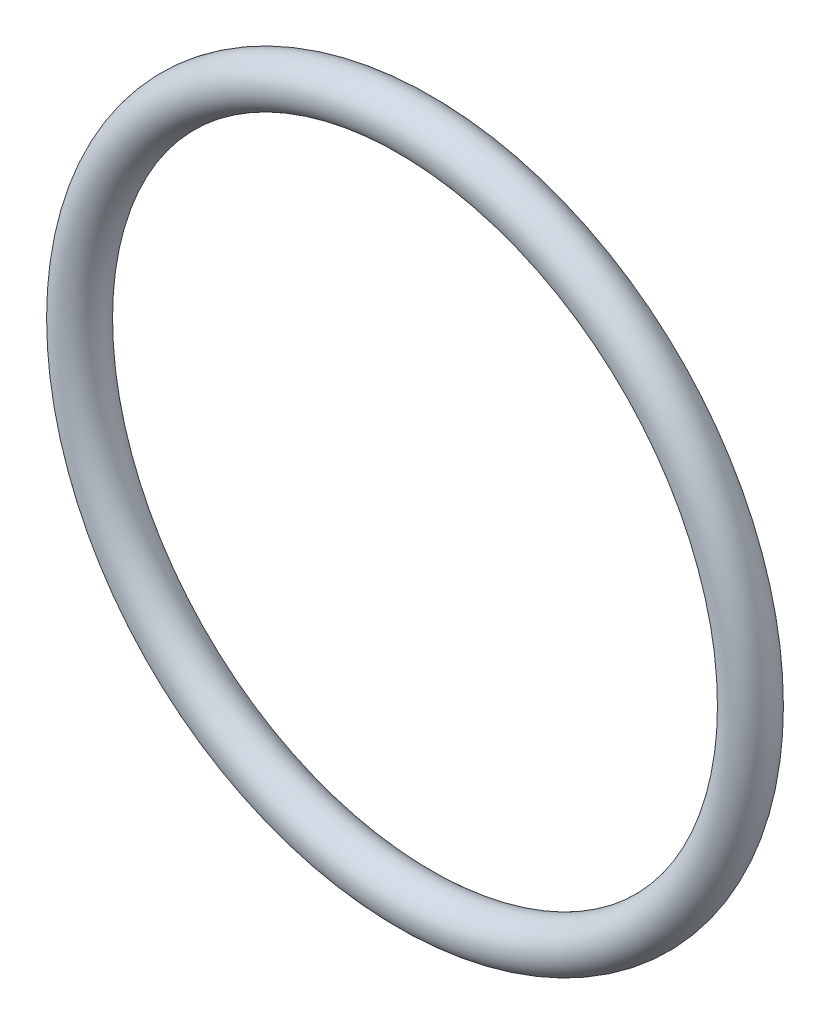
ISO-10303-21;
HEADER;
FILE_DESCRIPTION(('STEP AP214'),'2;1');
FILE_NAME('part.step','',(''),(''),'','','');
FILE_SCHEMA(('AUTOMOTIVE_DESIGN { 1 0 10303 214 1 1 1 1 }'));
ENDSEC;
DATA;
#1=APPLICATION_CONTEXT('core data for automotive mechanical design processes');
#2=APPLICATION_PROTOCOL_DEFINITION('international standard','automotive_design',2000,#1);
#3=PRODUCT_CONTEXT('',#1,'mechanical');
#4=PRODUCT('Part','Part','',(#3));
#5=PRODUCT_RELATED_PRODUCT_CATEGORY('part','',(#4));
#6=PRODUCT_DEFINITION_FORMATION('','',#4);
#7=PRODUCT_DEFINITION_CONTEXT('part definition',#1,'design');
#8=PRODUCT_DEFINITION('design','',#6,#7);
#9=PRODUCT_DEFINITION_SHAPE('','',#8);
#10=(LENGTH_UNIT() NAMED_UNIT(*) SI_UNIT(.MILLI.,.METRE.));
#11=(NAMED_UNIT(*) PLANE_ANGLE_UNIT() SI_UNIT($,.RADIAN.));
#12=(NAMED_UNIT(*) SI_UNIT($,.STERADIAN.) SOLID_ANGLE_UNIT());
#13=UNCERTAINTY_MEASURE_WITH_UNIT(LENGTH_MEASURE(1.E-05),#10,'distance_accuracy_value','');
#14=(GEOMETRIC_REPRESENTATION_CONTEXT(3) GLOBAL_UNCERTAINTY_ASSIGNED_CONTEXT((#13)) GLOBAL_UNIT_ASSIGNED_CONTEXT((#10,
#11,#12)) REPRESENTATION_CONTEXT('',''));
#15=CARTESIAN_POINT('',(0.,0.,0.));
#16=DIRECTION('',(0.,0.,1.));
#17=DIRECTION('',(1.,0.,0.));
#18=AXIS2_PLACEMENT_3D('',#15,#16,#17);
#19=CARTESIAN_POINT('',(0.,0.,0.));
#20=DIRECTION('',(0.,0.,1.));
#21=DIRECTION('',(1.,0.,0.));
#22=AXIS2_PLACEMENT_3D('',#19,#20,#21);
#23=TOROIDAL_SURFACE('',#22,25.3746,1.76530000000001);
#24=CARTESIAN_POINT('',(27.1399,0.,0.));
#25=VERTEX_POINT('',#24);
#26=VERTEX_LOOP('',#25);
#27=FACE_BOUND('',#26,.T.);
#28=ADVANCED_FACE('F28',(#27),#23,.T.);
#29=CLOSED_SHELL('',(#28));
#30=MANIFOLD_SOLID_BREP('B2',#29);
#31=ADVANCED_BREP_SHAPE_REPRESENTATION('',(#18,#30),#14);
#32=SHAPE_DEFINITION_REPRESENTATION(#9,#31);
ENDSEC;
END-ISO-10303-21;
